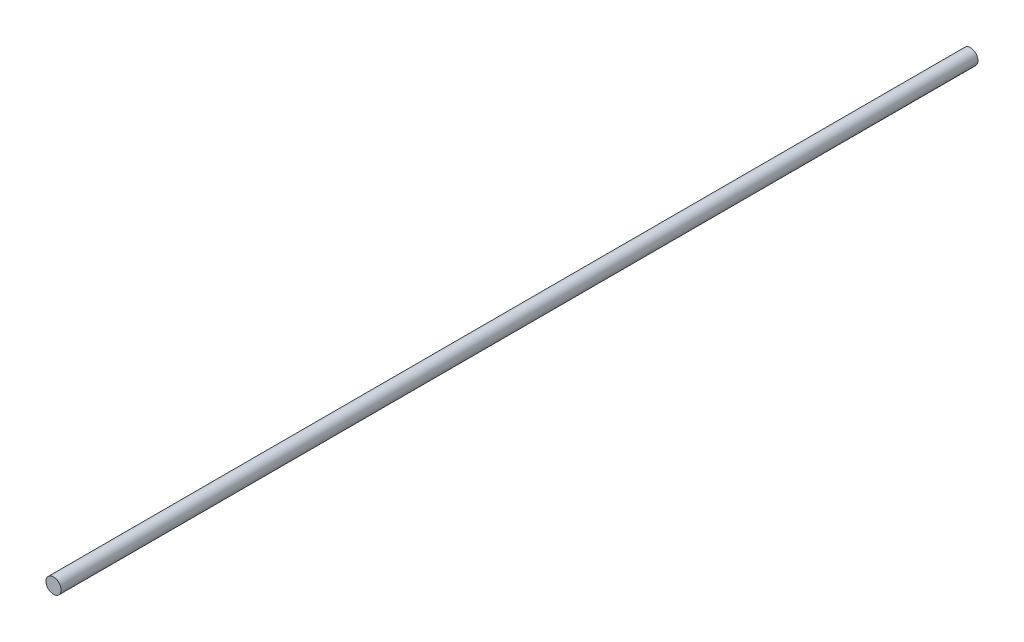
ISO-10303-21;
HEADER;
FILE_DESCRIPTION(('STEP AP214'),'2;1');
FILE_NAME('part.step','',(''),(''),'','','');
FILE_SCHEMA(('AUTOMOTIVE_DESIGN { 1 0 10303 214 1 1 1 1 }'));
ENDSEC;
DATA;
#1=APPLICATION_CONTEXT('core data for automotive mechanical design processes');
#2=APPLICATION_PROTOCOL_DEFINITION('international standard','automotive_design',2000,#1);
#3=PRODUCT_CONTEXT('',#1,'mechanical');
#4=PRODUCT('Part','Part','',(#3));
#5=PRODUCT_RELATED_PRODUCT_CATEGORY('part','',(#4));
#6=PRODUCT_DEFINITION_FORMATION('','',#4);
#7=PRODUCT_DEFINITION_CONTEXT('part definition',#1,'design');
#8=PRODUCT_DEFINITION('design','',#6,#7);
#9=PRODUCT_DEFINITION_SHAPE('','',#8);
#10=(LENGTH_UNIT() NAMED_UNIT(*) SI_UNIT(.MILLI.,.METRE.));
#11=(NAMED_UNIT(*) PLANE_ANGLE_UNIT() SI_UNIT($,.RADIAN.));
#12=(NAMED_UNIT(*) SI_UNIT($,.STERADIAN.) SOLID_ANGLE_UNIT());
#13=UNCERTAINTY_MEASURE_WITH_UNIT(LENGTH_MEASURE(1.E-05),#10,'distance_accuracy_value','');
#14=(GEOMETRIC_REPRESENTATION_CONTEXT(3) GLOBAL_UNCERTAINTY_ASSIGNED_CONTEXT((#13)) GLOBAL_UNIT_ASSIGNED_CONTEXT((#10,
#11,#12)) REPRESENTATION_CONTEXT('',''));
#15=CARTESIAN_POINT('',(0.,0.,0.));
#16=DIRECTION('',(0.,0.,1.));
#17=DIRECTION('',(1.,0.,0.));
#18=AXIS2_PLACEMENT_3D('',#15,#16,#17);
#19=CARTESIAN_POINT('',(0.,0.,182.));
#20=DIRECTION('',(0.,0.,-1.));
#21=DIRECTION('',(-1.,0.,0.));
#22=AXIS2_PLACEMENT_3D('',#19,#20,#21);
#23=CYLINDRICAL_SURFACE('',#22,1.5);
#24=CARTESIAN_POINT('',(0.,0.,182.));
#25=DIRECTION('',(0.,0.,1.));
#26=DIRECTION('',(1.,0.,0.));
#27=AXIS2_PLACEMENT_3D('',#24,#25,#26);
#28=CIRCLE('',#27,1.5);
#29=CARTESIAN_POINT('',(1.5,0.,182.));
#30=VERTEX_POINT('',#29);
#31=EDGE_CURVE('E10',#30,#30,#28,.T.);
#32=ORIENTED_EDGE('',*,*,#31,.F.);
#33=EDGE_LOOP('',(#32));
#34=FACE_BOUND('',#33,.T.);
#35=CARTESIAN_POINT('',(0.,0.,0.));
#36=DIRECTION('',(0.,0.,1.));
#37=DIRECTION('',(1.,0.,0.));
#38=AXIS2_PLACEMENT_3D('',#35,#36,#37);
#39=CIRCLE('',#38,1.5);
#40=CARTESIAN_POINT('',(1.5,0.,0.));
#41=VERTEX_POINT('',#40);
#42=EDGE_CURVE('E35',#41,#41,#39,.T.);
#43=ORIENTED_EDGE('',*,*,#42,.T.);
#44=EDGE_LOOP('',(#43));
#45=FACE_BOUND('',#44,.T.);
#46=ADVANCED_FACE('F32',(#34,#45),#23,.T.);
#47=CARTESIAN_POINT('',(0.,0.,182.));
#48=DIRECTION('',(0.,0.,1.));
#49=DIRECTION('',(1.,0.,0.));
#50=AXIS2_PLACEMENT_3D('',#47,#48,#49);
#51=PLANE('',#50);
#52=ORIENTED_EDGE('',*,*,#31,.T.);
#53=EDGE_LOOP('',(#52));
#54=FACE_BOUND('',#53,.T.);
#55=ADVANCED_FACE('F47',(#54),#51,.T.);
#56=CARTESIAN_POINT('',(0.,0.,0.));
#57=DIRECTION('',(0.,0.,1.));
#58=DIRECTION('',(1.,0.,0.));
#59=AXIS2_PLACEMENT_3D('',#56,#57,#58);
#60=PLANE('',#59);
#61=ORIENTED_EDGE('',*,*,#42,.F.);
#62=EDGE_LOOP('',(#61));
#63=FACE_BOUND('',#62,.T.);
#64=ADVANCED_FACE('F45',(#63),#60,.F.);
#65=CLOSED_SHELL('',(#46,#55,#64));
#66=MANIFOLD_SOLID_BREP('B2',#65);
#67=ADVANCED_BREP_SHAPE_REPRESENTATION('',(#18,#66),#14);
#68=SHAPE_DEFINITION_REPRESENTATION(#9,#67);
ENDSEC;
END-ISO-10303-21;
